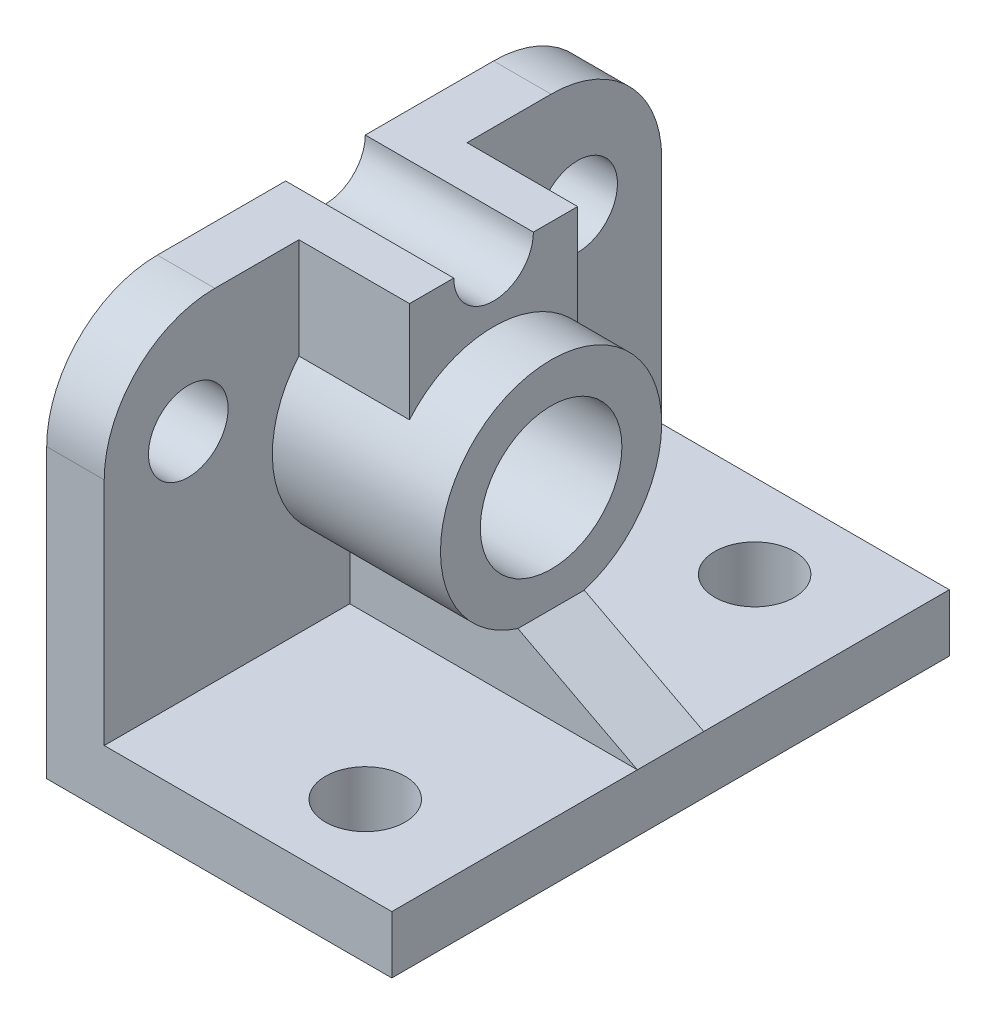
ISO-10303-21;
HEADER;
FILE_DESCRIPTION(('STEP AP214'),'2;1');
FILE_NAME('part.step','',(''),(''),'','','');
FILE_SCHEMA(('AUTOMOTIVE_DESIGN { 1 0 10303 214 1 1 1 1 }'));
ENDSEC;
DATA;
#1=APPLICATION_CONTEXT('core data for automotive mechanical design processes');
#2=APPLICATION_PROTOCOL_DEFINITION('international standard','automotive_design',2000,#1);
#3=PRODUCT_CONTEXT('',#1,'mechanical');
#4=PRODUCT('Part','Part','',(#3));
#5=PRODUCT_RELATED_PRODUCT_CATEGORY('part','',(#4));
#6=PRODUCT_DEFINITION_FORMATION('','',#4);
#7=PRODUCT_DEFINITION_CONTEXT('part definition',#1,'design');
#8=PRODUCT_DEFINITION('design','',#6,#7);
#9=PRODUCT_DEFINITION_SHAPE('','',#8);
#10=(LENGTH_UNIT() NAMED_UNIT(*) SI_UNIT(.MILLI.,.METRE.));
#11=(NAMED_UNIT(*) PLANE_ANGLE_UNIT() SI_UNIT($,.RADIAN.));
#12=(NAMED_UNIT(*) SI_UNIT($,.STERADIAN.) SOLID_ANGLE_UNIT());
#13=UNCERTAINTY_MEASURE_WITH_UNIT(LENGTH_MEASURE(1.E-05),#10,'distance_accuracy_value','');
#14=(GEOMETRIC_REPRESENTATION_CONTEXT(3) GLOBAL_UNCERTAINTY_ASSIGNED_CONTEXT((#13)) GLOBAL_UNIT_ASSIGNED_CONTEXT((#10,
#11,#12)) REPRESENTATION_CONTEXT('',''));
#15=CARTESIAN_POINT('',(0.,0.,0.));
#16=DIRECTION('',(0.,0.,1.));
#17=DIRECTION('',(1.,0.,0.));
#18=AXIS2_PLACEMENT_3D('',#15,#16,#17);
#19=CARTESIAN_POINT('',(13.,13.,63.));
#20=DIRECTION('',(-1.,0.,0.));
#21=DIRECTION('',(0.,0.,1.));
#22=AXIS2_PLACEMENT_3D('',#19,#20,#21);
#23=PLANE('',#22);
#24=CARTESIAN_POINT('',(13.,65.,-44.));
#25=DIRECTION('',(-1.,0.,0.));
#26=DIRECTION('',(0.,0.,1.));
#27=AXIS2_PLACEMENT_3D('',#24,#25,#26);
#28=CIRCLE('',#27,9.00000000000001);
#29=CARTESIAN_POINT('',(13.,65.,-35.));
#30=VERTEX_POINT('',#29);
#31=EDGE_CURVE('E220',#30,#30,#28,.T.);
#32=ORIENTED_EDGE('',*,*,#31,.T.);
#33=EDGE_LOOP('',(#32));
#34=FACE_BOUND('',#33,.T.);
#35=DIRECTION('',(0.,1.,0.));
#36=VECTOR('',#35,1.);
#37=CARTESIAN_POINT('',(13.,13.,-63.));
#38=LINE('',#37,#36);
#39=CARTESIAN_POINT('',(13.,13.,-63.));
#40=VERTEX_POINT('',#39);
#41=CARTESIAN_POINT('',(13.,65.,-63.));
#42=VERTEX_POINT('',#41);
#43=EDGE_CURVE('E271',#40,#42,#38,.T.);
#44=ORIENTED_EDGE('',*,*,#43,.T.);
#45=CARTESIAN_POINT('',(13.,65.,-38.));
#46=DIRECTION('',(-1.,0.,0.));
#47=DIRECTION('',(0.,0.,1.));
#48=AXIS2_PLACEMENT_3D('',#45,#46,#47);
#49=CIRCLE('',#48,25.);
#50=CARTESIAN_POINT('',(13.,90.,-38.));
#51=VERTEX_POINT('',#50);
#52=EDGE_CURVE('E237',#42,#51,#49,.F.);
#53=ORIENTED_EDGE('',*,*,#52,.T.);
#54=DIRECTION('',(0.,0.,-1.));
#55=VECTOR('',#54,1.);
#56=CARTESIAN_POINT('',(13.,90.,63.));
#57=LINE('',#56,#55);
#58=CARTESIAN_POINT('',(13.,90.,-19.));
#59=VERTEX_POINT('',#58);
#60=EDGE_CURVE('E278',#59,#51,#57,.T.);
#61=ORIENTED_EDGE('',*,*,#60,.F.);
#62=DIRECTION('',(0.,-1.,0.));
#63=VECTOR('',#62,1.);
#64=CARTESIAN_POINT('',(13.,0.,-19.));
#65=LINE('',#64,#63);
#66=CARTESIAN_POINT('',(13.,67.2480768092719,-19.));
#67=VERTEX_POINT('',#66);
#68=EDGE_CURVE('E436',#59,#67,#65,.T.);
#69=ORIENTED_EDGE('',*,*,#68,.T.);
#70=CARTESIAN_POINT('',(13.,51.,0.));
#71=DIRECTION('',(1.,0.,0.));
#72=DIRECTION('',(0.,0.,-1.));
#73=AXIS2_PLACEMENT_3D('',#70,#71,#72);
#74=CIRCLE('',#73,25.);
#75=CARTESIAN_POINT('',(13.,27.1515199645764,-7.5));
#76=VERTEX_POINT('',#75);
#77=EDGE_CURVE('E468',#76,#67,#74,.T.);
#78=ORIENTED_EDGE('',*,*,#77,.F.);
#79=DIRECTION('',(0.,1.,0.));
#80=VECTOR('',#79,1.);
#81=CARTESIAN_POINT('',(13.,0.,-7.5));
#82=LINE('',#81,#80);
#83=CARTESIAN_POINT('',(13.,13.,-7.5));
#84=VERTEX_POINT('',#83);
#85=EDGE_CURVE('E215',#84,#76,#82,.T.);
#86=ORIENTED_EDGE('',*,*,#85,.F.);
#87=DIRECTION('',(0.,0.,-1.));
#88=VECTOR('',#87,1.);
#89=CARTESIAN_POINT('',(13.,13.,63.));
#90=LINE('',#89,#88);
#91=EDGE_CURVE('E280',#84,#40,#90,.T.);
#92=ORIENTED_EDGE('',*,*,#91,.T.);
#93=EDGE_LOOP('',(#44,#53,#61,#69,#78,#86,#92));
#94=FACE_BOUND('',#93,.T.);
#95=ADVANCED_FACE('F39',(#34,#94),#23,.F.);
#96=CARTESIAN_POINT('',(13.,65.,44.));
#97=DIRECTION('',(1.,0.,0.));
#98=DIRECTION('',(0.,0.,-1.));
#99=AXIS2_PLACEMENT_3D('',#96,#97,#98);
#100=CIRCLE('',#99,9.00000000000001);
#101=CARTESIAN_POINT('',(13.,65.,35.));
#102=VERTEX_POINT('',#101);
#103=EDGE_CURVE('E216',#102,#102,#100,.T.);
#104=ORIENTED_EDGE('',*,*,#103,.F.);
#105=EDGE_LOOP('',(#104));
#106=FACE_BOUND('',#105,.T.);
#107=CARTESIAN_POINT('',(13.,90.,38.));
#108=VERTEX_POINT('',#107);
#109=CARTESIAN_POINT('',(13.,90.,19.));
#110=VERTEX_POINT('',#109);
#111=EDGE_CURVE('E279',#108,#110,#57,.T.);
#112=ORIENTED_EDGE('',*,*,#111,.F.);
#113=CARTESIAN_POINT('',(13.,65.,38.));
#114=DIRECTION('',(-1.,0.,0.));
#115=DIRECTION('',(0.,0.,1.));
#116=AXIS2_PLACEMENT_3D('',#113,#114,#115);
#117=CIRCLE('',#116,25.);
#118=CARTESIAN_POINT('',(13.,65.,63.));
#119=VERTEX_POINT('',#118);
#120=EDGE_CURVE('E11',#108,#119,#117,.F.);
#121=ORIENTED_EDGE('',*,*,#120,.T.);
#122=DIRECTION('',(0.,1.,0.));
#123=VECTOR('',#122,1.);
#124=CARTESIAN_POINT('',(13.,13.,63.));
#125=LINE('',#124,#123);
#126=CARTESIAN_POINT('',(13.,13.,63.));
#127=VERTEX_POINT('',#126);
#128=EDGE_CURVE('E248',#127,#119,#125,.T.);
#129=ORIENTED_EDGE('',*,*,#128,.F.);
#130=CARTESIAN_POINT('',(13.,13.,7.5));
#131=VERTEX_POINT('',#130);
#132=EDGE_CURVE('E202',#127,#131,#90,.T.);
#133=ORIENTED_EDGE('',*,*,#132,.T.);
#134=DIRECTION('',(0.,-1.,0.));
#135=VECTOR('',#134,1.);
#136=CARTESIAN_POINT('',(13.,0.,7.5));
#137=LINE('',#136,#135);
#138=CARTESIAN_POINT('',(13.,27.1515199645764,7.5));
#139=VERTEX_POINT('',#138);
#140=EDGE_CURVE('E188',#139,#131,#137,.T.);
#141=ORIENTED_EDGE('',*,*,#140,.F.);
#142=CARTESIAN_POINT('',(13.,67.2480768092719,19.));
#143=VERTEX_POINT('',#142);
#144=EDGE_CURVE('E463',#143,#139,#74,.T.);
#145=ORIENTED_EDGE('',*,*,#144,.F.);
#146=DIRECTION('',(0.,-1.,0.));
#147=VECTOR('',#146,1.);
#148=CARTESIAN_POINT('',(13.,0.,19.));
#149=LINE('',#148,#147);
#150=EDGE_CURVE('E211',#110,#143,#149,.T.);
#151=ORIENTED_EDGE('',*,*,#150,.F.);
#152=EDGE_LOOP('',(#112,#121,#129,#133,#141,#145,#151));
#153=FACE_BOUND('',#152,.T.);
#154=ADVANCED_FACE('F312',(#106,#153),#23,.F.);
#155=CARTESIAN_POINT('',(13.,13.,63.));
#156=DIRECTION('',(0.,-1.,0.));
#157=DIRECTION('',(1.,0.,0.));
#158=AXIS2_PLACEMENT_3D('',#155,#156,#157);
#159=PLANE('',#158);
#160=CARTESIAN_POINT('',(53.,13.,-44.));
#161=DIRECTION('',(0.,-1.,0.));
#162=DIRECTION('',(-1.,0.,0.));
#163=AXIS2_PLACEMENT_3D('',#160,#161,#162);
#164=CIRCLE('',#163,9.);
#165=CARTESIAN_POINT('',(44.,13.,-44.));
#166=VERTEX_POINT('',#165);
#167=EDGE_CURVE('E228',#166,#166,#164,.T.);
#168=ORIENTED_EDGE('',*,*,#167,.T.);
#169=EDGE_LOOP('',(#168));
#170=FACE_BOUND('',#169,.T.);
#171=DIRECTION('',(-1.,0.,0.));
#172=VECTOR('',#171,1.);
#173=CARTESIAN_POINT('',(78.,13.,-7.5));
#174=LINE('',#173,#172);
#175=CARTESIAN_POINT('',(78.,13.,-7.5));
#176=VERTEX_POINT('',#175);
#177=EDGE_CURVE('E193',#176,#84,#174,.T.);
#178=ORIENTED_EDGE('',*,*,#177,.F.);
#179=DIRECTION('',(0.,0.,-1.));
#180=VECTOR('',#179,1.);
#181=CARTESIAN_POINT('',(78.,13.,63.));
#182=LINE('',#181,#180);
#183=CARTESIAN_POINT('',(78.,13.,-63.));
#184=VERTEX_POINT('',#183);
#185=EDGE_CURVE('E181',#176,#184,#182,.T.);
#186=ORIENTED_EDGE('',*,*,#185,.T.);
#187=DIRECTION('',(-1.,0.,0.));
#188=VECTOR('',#187,1.);
#189=CARTESIAN_POINT('',(13.,13.,-63.));
#190=LINE('',#189,#188);
#191=EDGE_CURVE('E268',#184,#40,#190,.T.);
#192=ORIENTED_EDGE('',*,*,#191,.T.);
#193=ORIENTED_EDGE('',*,*,#91,.F.);
#194=EDGE_LOOP('',(#178,#186,#192,#193));
#195=FACE_BOUND('',#194,.T.);
#196=ADVANCED_FACE('F315',(#170,#195),#159,.F.);
#197=CARTESIAN_POINT('',(53.,13.,44.));
#198=DIRECTION('',(0.,1.,0.));
#199=DIRECTION('',(-1.,0.,0.));
#200=AXIS2_PLACEMENT_3D('',#197,#198,#199);
#201=CIRCLE('',#200,9.);
#202=CARTESIAN_POINT('',(44.,13.,44.));
#203=VERTEX_POINT('',#202);
#204=EDGE_CURVE('E224',#203,#203,#201,.T.);
#205=ORIENTED_EDGE('',*,*,#204,.F.);
#206=EDGE_LOOP('',(#205));
#207=FACE_BOUND('',#206,.T.);
#208=DIRECTION('',(-1.,0.,0.));
#209=VECTOR('',#208,1.);
#210=CARTESIAN_POINT('',(78.,13.,7.5));
#211=LINE('',#210,#209);
#212=CARTESIAN_POINT('',(78.,13.,7.5));
#213=VERTEX_POINT('',#212);
#214=EDGE_CURVE('E185',#213,#131,#211,.T.);
#215=ORIENTED_EDGE('',*,*,#214,.T.);
#216=ORIENTED_EDGE('',*,*,#132,.F.);
#217=DIRECTION('',(-1.,0.,0.));
#218=VECTOR('',#217,1.);
#219=CARTESIAN_POINT('',(13.,13.,63.));
#220=LINE('',#219,#218);
#221=CARTESIAN_POINT('',(78.,13.,63.));
#222=VERTEX_POINT('',#221);
#223=EDGE_CURVE('E196',#222,#127,#220,.T.);
#224=ORIENTED_EDGE('',*,*,#223,.F.);
#225=EDGE_CURVE('E178',#222,#213,#182,.T.);
#226=ORIENTED_EDGE('',*,*,#225,.T.);
#227=EDGE_LOOP('',(#215,#216,#224,#226));
#228=FACE_BOUND('',#227,.T.);
#229=ADVANCED_FACE('F195',(#207,#228),#159,.F.);
#230=CARTESIAN_POINT('',(0.,90.,63.));
#231=DIRECTION('',(0.,-1.,0.));
#232=DIRECTION('',(0.,0.,-1.));
#233=AXIS2_PLACEMENT_3D('',#230,#231,#232);
#234=PLANE('',#233);
#235=ORIENTED_EDGE('',*,*,#60,.T.);
#236=DIRECTION('',(-1.,0.,0.));
#237=VECTOR('',#236,1.);
#238=CARTESIAN_POINT('',(0.,90.,-38.));
#239=LINE('',#238,#237);
#240=CARTESIAN_POINT('',(0.,90.,-38.));
#241=VERTEX_POINT('',#240);
#242=EDGE_CURVE('E208',#51,#241,#239,.T.);
#243=ORIENTED_EDGE('',*,*,#242,.T.);
#244=DIRECTION('',(0.,0.,-1.));
#245=VECTOR('',#244,1.);
#246=CARTESIAN_POINT('',(0.,90.,63.));
#247=LINE('',#246,#245);
#248=CARTESIAN_POINT('',(0.,90.,-9.));
#249=VERTEX_POINT('',#248);
#250=EDGE_CURVE('E257',#249,#241,#247,.T.);
#251=ORIENTED_EDGE('',*,*,#250,.F.);
#252=DIRECTION('',(-1.,0.,0.));
#253=VECTOR('',#252,1.);
#254=CARTESIAN_POINT('',(38.,90.,-9.));
#255=LINE('',#254,#253);
#256=CARTESIAN_POINT('',(38.,90.,-9.));
#257=VERTEX_POINT('',#256);
#258=EDGE_CURVE('E450',#257,#249,#255,.T.);
#259=ORIENTED_EDGE('',*,*,#258,.F.);
#260=DIRECTION('',(0.,0.,1.));
#261=VECTOR('',#260,1.);
#262=CARTESIAN_POINT('',(38.,90.,0.));
#263=LINE('',#262,#261);
#264=CARTESIAN_POINT('',(38.,90.,-19.));
#265=VERTEX_POINT('',#264);
#266=EDGE_CURVE('E439',#265,#257,#263,.T.);
#267=ORIENTED_EDGE('',*,*,#266,.F.);
#268=DIRECTION('',(-1.,0.,0.));
#269=VECTOR('',#268,1.);
#270=CARTESIAN_POINT('',(38.,90.,-19.));
#271=LINE('',#270,#269);
#272=EDGE_CURVE('E290',#265,#59,#271,.T.);
#273=ORIENTED_EDGE('',*,*,#272,.T.);
#274=EDGE_LOOP('',(#235,#243,#251,#259,#267,#273));
#275=FACE_BOUND('',#274,.T.);
#276=ADVANCED_FACE('F287',(#275),#234,.F.);
#277=CARTESIAN_POINT('',(51.,51.,0.));
#278=DIRECTION('',(-1.,0.,0.));
#279=DIRECTION('',(0.,0.,1.));
#280=AXIS2_PLACEMENT_3D('',#277,#278,#279);
#281=CYLINDRICAL_SURFACE('',#280,25.);
#282=DIRECTION('',(-1.,0.,0.));
#283=VECTOR('',#282,1.);
#284=CARTESIAN_POINT('',(38.,67.2480768092719,19.));
#285=LINE('',#284,#283);
#286=CARTESIAN_POINT('',(38.,67.248076809272,19.));
#287=VERTEX_POINT('',#286);
#288=EDGE_CURVE('E455',#287,#143,#285,.T.);
#289=ORIENTED_EDGE('',*,*,#288,.T.);
#290=ORIENTED_EDGE('',*,*,#144,.T.);
#291=DIRECTION('',(-1.,0.,0.));
#292=VECTOR('',#291,1.);
#293=CARTESIAN_POINT('',(51.,27.1515199645764,7.5));
#294=LINE('',#293,#292);
#295=CARTESIAN_POINT('',(51.,27.1515199645764,7.5));
#296=VERTEX_POINT('',#295);
#297=EDGE_CURVE('E266',#296,#139,#294,.T.);
#298=ORIENTED_EDGE('',*,*,#297,.F.);
#299=CARTESIAN_POINT('',(51.,51.,0.));
#300=DIRECTION('',(1.,0.,0.));
#301=DIRECTION('',(0.,0.,-1.));
#302=AXIS2_PLACEMENT_3D('',#299,#300,#301);
#303=CIRCLE('',#302,25.);
#304=CARTESIAN_POINT('',(51.,27.1515199645764,-7.5));
#305=VERTEX_POINT('',#304);
#306=EDGE_CURVE('E467',#305,#296,#303,.T.);
#307=ORIENTED_EDGE('',*,*,#306,.F.);
#308=DIRECTION('',(-1.,0.,0.));
#309=VECTOR('',#308,1.);
#310=CARTESIAN_POINT('',(51.,27.1515199645764,-7.5));
#311=LINE('',#310,#309);
#312=EDGE_CURVE('E471',#305,#76,#311,.T.);
#313=ORIENTED_EDGE('',*,*,#312,.T.);
#314=ORIENTED_EDGE('',*,*,#77,.T.);
#315=DIRECTION('',(-1.,0.,0.));
#316=VECTOR('',#315,1.);
#317=CARTESIAN_POINT('',(38.,67.2480768092719,-19.));
#318=LINE('',#317,#316);
#319=CARTESIAN_POINT('',(38.,67.2480768092719,-19.));
#320=VERTEX_POINT('',#319);
#321=EDGE_CURVE('E453',#320,#67,#318,.T.);
#322=ORIENTED_EDGE('',*,*,#321,.F.);
#323=CARTESIAN_POINT('',(38.,51.,0.));
#324=DIRECTION('',(1.,0.,0.));
#325=DIRECTION('',(0.,0.,-1.));
#326=AXIS2_PLACEMENT_3D('',#323,#324,#325);
#327=CIRCLE('',#326,25.);
#328=EDGE_CURVE('E442',#320,#287,#327,.T.);
#329=ORIENTED_EDGE('',*,*,#328,.T.);
#330=EDGE_LOOP('',(#289,#290,#298,#307,#313,#314,#322,#329));
#331=FACE_BOUND('',#330,.T.);
#332=ADVANCED_FACE('F333',(#331),#281,.T.);
#333=CARTESIAN_POINT('',(0.,0.,63.));
#334=DIRECTION('',(0.,1.,0.));
#335=DIRECTION('',(0.,0.,1.));
#336=AXIS2_PLACEMENT_3D('',#333,#334,#335);
#337=PLANE('',#336);
#338=CARTESIAN_POINT('',(53.,0.,-44.));
#339=DIRECTION('',(0.,1.,0.));
#340=DIRECTION('',(0.,0.,1.));
#341=AXIS2_PLACEMENT_3D('',#338,#339,#340);
#342=CIRCLE('',#341,9.);
#343=CARTESIAN_POINT('',(53.,0.,-35.));
#344=VERTEX_POINT('',#343);
#345=EDGE_CURVE('E225',#344,#344,#342,.F.);
#346=ORIENTED_EDGE('',*,*,#345,.F.);
#347=EDGE_LOOP('',(#346));
#348=FACE_BOUND('',#347,.T.);
#349=CARTESIAN_POINT('',(53.,0.,44.));
#350=DIRECTION('',(0.,1.,0.));
#351=DIRECTION('',(0.,0.,1.));
#352=AXIS2_PLACEMENT_3D('',#349,#350,#351);
#353=CIRCLE('',#352,9.);
#354=CARTESIAN_POINT('',(53.,0.,53.));
#355=VERTEX_POINT('',#354);
#356=EDGE_CURVE('E221',#355,#355,#353,.T.);
#357=ORIENTED_EDGE('',*,*,#356,.T.);
#358=EDGE_LOOP('',(#357));
#359=FACE_BOUND('',#358,.T.);
#360=DIRECTION('',(1.,0.,0.));
#361=VECTOR('',#360,1.);
#362=CARTESIAN_POINT('',(0.,0.,-63.));
#363=LINE('',#362,#361);
#364=CARTESIAN_POINT('',(0.,0.,-63.));
#365=VERTEX_POINT('',#364);
#366=CARTESIAN_POINT('',(78.,0.,-63.));
#367=VERTEX_POINT('',#366);
#368=EDGE_CURVE('E262',#365,#367,#363,.T.);
#369=ORIENTED_EDGE('',*,*,#368,.T.);
#370=DIRECTION('',(0.,0.,-1.));
#371=VECTOR('',#370,1.);
#372=CARTESIAN_POINT('',(78.,0.,63.));
#373=LINE('',#372,#371);
#374=CARTESIAN_POINT('',(78.,0.,63.));
#375=VERTEX_POINT('',#374);
#376=EDGE_CURVE('E197',#375,#367,#373,.T.);
#377=ORIENTED_EDGE('',*,*,#376,.F.);
#378=DIRECTION('',(1.,0.,0.));
#379=VECTOR('',#378,1.);
#380=CARTESIAN_POINT('',(0.,0.,63.));
#381=LINE('',#380,#379);
#382=CARTESIAN_POINT('',(0.,0.,63.));
#383=VERTEX_POINT('',#382);
#384=EDGE_CURVE('E275',#383,#375,#381,.T.);
#385=ORIENTED_EDGE('',*,*,#384,.F.);
#386=DIRECTION('',(0.,0.,-1.));
#387=VECTOR('',#386,1.);
#388=CARTESIAN_POINT('',(0.,0.,63.));
#389=LINE('',#388,#387);
#390=EDGE_CURVE('E254',#383,#365,#389,.T.);
#391=ORIENTED_EDGE('',*,*,#390,.T.);
#392=EDGE_LOOP('',(#369,#377,#385,#391));
#393=FACE_BOUND('',#392,.T.);
#394=ADVANCED_FACE('F306',(#348,#359,#393),#337,.F.);
#395=CARTESIAN_POINT('',(78.,0.,63.));
#396=DIRECTION('',(-1.,0.,0.));
#397=DIRECTION('',(0.,0.,1.));
#398=AXIS2_PLACEMENT_3D('',#395,#396,#397);
#399=PLANE('',#398);
#400=ORIENTED_EDGE('',*,*,#185,.F.);
#401=DIRECTION('',(0.,0.,1.));
#402=VECTOR('',#401,1.);
#403=CARTESIAN_POINT('',(78.,13.,-30.5));
#404=LINE('',#403,#402);
#405=EDGE_CURVE('E165',#176,#213,#404,.T.);
#406=ORIENTED_EDGE('',*,*,#405,.T.);
#407=ORIENTED_EDGE('',*,*,#225,.F.);
#408=DIRECTION('',(0.,1.,0.));
#409=VECTOR('',#408,1.);
#410=CARTESIAN_POINT('',(78.,0.,63.));
#411=LINE('',#410,#409);
#412=EDGE_CURVE('E307',#375,#222,#411,.T.);
#413=ORIENTED_EDGE('',*,*,#412,.F.);
#414=ORIENTED_EDGE('',*,*,#376,.T.);
#415=DIRECTION('',(0.,1.,0.));
#416=VECTOR('',#415,1.);
#417=CARTESIAN_POINT('',(78.,0.,-63.));
#418=LINE('',#417,#416);
#419=EDGE_CURVE('E265',#367,#184,#418,.T.);
#420=ORIENTED_EDGE('',*,*,#419,.T.);
#421=EDGE_LOOP('',(#400,#406,#407,#413,#414,#420));
#422=FACE_BOUND('',#421,.T.);
#423=ADVANCED_FACE('F176',(#422),#399,.F.);
#424=CARTESIAN_POINT('',(0.,90.,38.));
#425=VERTEX_POINT('',#424);
#426=CARTESIAN_POINT('',(0.,90.,9.));
#427=VERTEX_POINT('',#426);
#428=EDGE_CURVE('E277',#425,#427,#247,.T.);
#429=ORIENTED_EDGE('',*,*,#428,.F.);
#430=DIRECTION('',(-1.,0.,0.));
#431=VECTOR('',#430,1.);
#432=CARTESIAN_POINT('',(13.,90.,38.));
#433=LINE('',#432,#431);
#434=EDGE_CURVE('E47',#425,#108,#433,.F.);
#435=ORIENTED_EDGE('',*,*,#434,.T.);
#436=ORIENTED_EDGE('',*,*,#111,.T.);
#437=DIRECTION('',(-1.,0.,0.));
#438=VECTOR('',#437,1.);
#439=CARTESIAN_POINT('',(38.,90.,19.));
#440=LINE('',#439,#438);
#441=CARTESIAN_POINT('',(38.,90.,19.));
#442=VERTEX_POINT('',#441);
#443=EDGE_CURVE('E458',#442,#110,#440,.T.);
#444=ORIENTED_EDGE('',*,*,#443,.F.);
#445=CARTESIAN_POINT('',(38.,90.,9.));
#446=VERTEX_POINT('',#445);
#447=EDGE_CURVE('E435',#446,#442,#263,.T.);
#448=ORIENTED_EDGE('',*,*,#447,.F.);
#449=DIRECTION('',(-1.,0.,0.));
#450=VECTOR('',#449,1.);
#451=CARTESIAN_POINT('',(38.,90.,9.));
#452=LINE('',#451,#450);
#453=EDGE_CURVE('E460',#446,#427,#452,.T.);
#454=ORIENTED_EDGE('',*,*,#453,.T.);
#455=EDGE_LOOP('',(#429,#435,#436,#444,#448,#454));
#456=FACE_BOUND('',#455,.T.);
#457=ADVANCED_FACE('F327',(#456),#234,.F.);
#458=CARTESIAN_POINT('',(0.,0.,63.));
#459=DIRECTION('',(1.,0.,0.));
#460=DIRECTION('',(0.,0.,-1.));
#461=AXIS2_PLACEMENT_3D('',#458,#459,#460);
#462=PLANE('',#461);
#463=CARTESIAN_POINT('',(0.,65.,-44.));
#464=DIRECTION('',(1.,0.,0.));
#465=DIRECTION('',(0.,0.,-1.));
#466=AXIS2_PLACEMENT_3D('',#463,#464,#465);
#467=CIRCLE('',#466,9.00000000000001);
#468=CARTESIAN_POINT('',(0.,65.,-53.));
#469=VERTEX_POINT('',#468);
#470=EDGE_CURVE('E217',#469,#469,#467,.F.);
#471=ORIENTED_EDGE('',*,*,#470,.F.);
#472=EDGE_LOOP('',(#471));
#473=FACE_BOUND('',#472,.T.);
#474=CARTESIAN_POINT('',(0.,65.,44.));
#475=DIRECTION('',(1.,0.,0.));
#476=DIRECTION('',(0.,0.,-1.));
#477=AXIS2_PLACEMENT_3D('',#474,#475,#476);
#478=CIRCLE('',#477,9.00000000000001);
#479=CARTESIAN_POINT('',(0.,65.,35.));
#480=VERTEX_POINT('',#479);
#481=EDGE_CURVE('E212',#480,#480,#478,.T.);
#482=ORIENTED_EDGE('',*,*,#481,.T.);
#483=EDGE_LOOP('',(#482));
#484=FACE_BOUND('',#483,.T.);
#485=CARTESIAN_POINT('',(0.,51.,0.));
#486=DIRECTION('',(1.,0.,0.));
#487=DIRECTION('',(0.,0.,-1.));
#488=AXIS2_PLACEMENT_3D('',#485,#486,#487);
#489=CIRCLE('',#488,16.);
#490=CARTESIAN_POINT('',(0.,51.,-16.));
#491=VERTEX_POINT('',#490);
#492=EDGE_CURVE('E192',#491,#491,#489,.T.);
#493=ORIENTED_EDGE('',*,*,#492,.T.);
#494=EDGE_LOOP('',(#493));
#495=FACE_BOUND('',#494,.T.);
#496=ORIENTED_EDGE('',*,*,#250,.T.);
#497=CARTESIAN_POINT('',(0.,65.,-38.));
#498=DIRECTION('',(1.,0.,0.));
#499=DIRECTION('',(0.,0.,-1.));
#500=AXIS2_PLACEMENT_3D('',#497,#498,#499);
#501=CIRCLE('',#500,25.);
#502=CARTESIAN_POINT('',(0.,65.,-63.));
#503=VERTEX_POINT('',#502);
#504=EDGE_CURVE('E233',#241,#503,#501,.F.);
#505=ORIENTED_EDGE('',*,*,#504,.T.);
#506=DIRECTION('',(0.,-1.,0.));
#507=VECTOR('',#506,1.);
#508=CARTESIAN_POINT('',(0.,0.,-63.));
#509=LINE('',#508,#507);
#510=EDGE_CURVE('E274',#503,#365,#509,.T.);
#511=ORIENTED_EDGE('',*,*,#510,.T.);
#512=ORIENTED_EDGE('',*,*,#390,.F.);
#513=DIRECTION('',(0.,-1.,0.));
#514=VECTOR('',#513,1.);
#515=CARTESIAN_POINT('',(0.,0.,63.));
#516=LINE('',#515,#514);
#517=CARTESIAN_POINT('',(0.,65.,63.));
#518=VERTEX_POINT('',#517);
#519=EDGE_CURVE('E246',#518,#383,#516,.T.);
#520=ORIENTED_EDGE('',*,*,#519,.F.);
#521=CARTESIAN_POINT('',(0.,65.,38.));
#522=DIRECTION('',(1.,0.,0.));
#523=DIRECTION('',(0.,0.,-1.));
#524=AXIS2_PLACEMENT_3D('',#521,#522,#523);
#525=CIRCLE('',#524,25.);
#526=EDGE_CURVE('E231',#518,#425,#525,.F.);
#527=ORIENTED_EDGE('',*,*,#526,.T.);
#528=ORIENTED_EDGE('',*,*,#428,.T.);
#529=CARTESIAN_POINT('',(0.,90.,0.));
#530=DIRECTION('',(1.,0.,0.));
#531=DIRECTION('',(0.,0.,-1.));
#532=AXIS2_PLACEMENT_3D('',#529,#530,#531);
#533=CIRCLE('',#532,9.);
#534=EDGE_CURVE('E200',#427,#249,#533,.T.);
#535=ORIENTED_EDGE('',*,*,#534,.T.);
#536=EDGE_LOOP('',(#496,#505,#511,#512,#520,#527,#528,#535));
#537=FACE_BOUND('',#536,.T.);
#538=ADVANCED_FACE('F252',(#473,#484,#495,#537),#462,.F.);
#539=CARTESIAN_POINT('',(0.,0.,63.));
#540=DIRECTION('',(0.,0.,1.));
#541=DIRECTION('',(1.,0.,0.));
#542=AXIS2_PLACEMENT_3D('',#539,#540,#541);
#543=PLANE('',#542);
#544=ORIENTED_EDGE('',*,*,#128,.T.);
#545=DIRECTION('',(-1.,0.,0.));
#546=VECTOR('',#545,1.);
#547=CARTESIAN_POINT('',(0.,65.,63.));
#548=LINE('',#547,#546);
#549=EDGE_CURVE('E239',#119,#518,#548,.T.);
#550=ORIENTED_EDGE('',*,*,#549,.T.);
#551=ORIENTED_EDGE('',*,*,#519,.T.);
#552=ORIENTED_EDGE('',*,*,#384,.T.);
#553=ORIENTED_EDGE('',*,*,#412,.T.);
#554=ORIENTED_EDGE('',*,*,#223,.T.);
#555=EDGE_LOOP('',(#544,#550,#551,#552,#553,#554));
#556=FACE_BOUND('',#555,.T.);
#557=ADVANCED_FACE('F244',(#556),#543,.T.);
#558=CARTESIAN_POINT('',(0.,0.,-63.));
#559=DIRECTION('',(0.,0.,1.));
#560=DIRECTION('',(1.,0.,0.));
#561=AXIS2_PLACEMENT_3D('',#558,#559,#560);
#562=PLANE('',#561);
#563=ORIENTED_EDGE('',*,*,#510,.F.);
#564=DIRECTION('',(-1.,0.,0.));
#565=VECTOR('',#564,1.);
#566=CARTESIAN_POINT('',(0.,65.,-63.));
#567=LINE('',#566,#565);
#568=EDGE_CURVE('E235',#503,#42,#567,.F.);
#569=ORIENTED_EDGE('',*,*,#568,.T.);
#570=ORIENTED_EDGE('',*,*,#43,.F.);
#571=ORIENTED_EDGE('',*,*,#191,.F.);
#572=ORIENTED_EDGE('',*,*,#419,.F.);
#573=ORIENTED_EDGE('',*,*,#368,.F.);
#574=EDGE_LOOP('',(#563,#569,#570,#571,#572,#573));
#575=FACE_BOUND('',#574,.T.);
#576=ADVANCED_FACE('F301',(#575),#562,.F.);
#577=CARTESIAN_POINT('',(51.,51.,0.));
#578=DIRECTION('',(-1.,0.,0.));
#579=DIRECTION('',(0.,0.,1.));
#580=AXIS2_PLACEMENT_3D('',#577,#578,#579);
#581=CYLINDRICAL_SURFACE('',#580,16.);
#582=CARTESIAN_POINT('',(51.,51.,0.));
#583=DIRECTION('',(1.,0.,0.));
#584=DIRECTION('',(0.,0.,-1.));
#585=AXIS2_PLACEMENT_3D('',#582,#583,#584);
#586=CIRCLE('',#585,16.);
#587=CARTESIAN_POINT('',(51.,51.,-16.));
#588=VERTEX_POINT('',#587);
#589=EDGE_CURVE('E464',#588,#588,#586,.T.);
#590=ORIENTED_EDGE('',*,*,#589,.T.);
#591=EDGE_LOOP('',(#590));
#592=FACE_BOUND('',#591,.T.);
#593=ORIENTED_EDGE('',*,*,#492,.F.);
#594=EDGE_LOOP('',(#593));
#595=FACE_BOUND('',#594,.T.);
#596=ADVANCED_FACE('F386',(#592,#595),#581,.F.);
#597=CARTESIAN_POINT('',(51.,0.,0.));
#598=DIRECTION('',(1.,0.,0.));
#599=DIRECTION('',(0.,0.,-1.));
#600=AXIS2_PLACEMENT_3D('',#597,#598,#599);
#601=PLANE('',#600);
#602=ORIENTED_EDGE('',*,*,#589,.F.);
#603=EDGE_LOOP('',(#602));
#604=FACE_BOUND('',#603,.T.);
#605=ORIENTED_EDGE('',*,*,#306,.T.);
#606=DIRECTION('',(0.,0.,-1.));
#607=VECTOR('',#606,1.);
#608=CARTESIAN_POINT('',(51.,27.1515199645764,0.));
#609=LINE('',#608,#607);
#610=EDGE_CURVE('E168',#296,#305,#609,.T.);
#611=ORIENTED_EDGE('',*,*,#610,.T.);
#612=EDGE_LOOP('',(#605,#611));
#613=FACE_BOUND('',#612,.T.);
#614=ADVANCED_FACE('F382',(#604,#613),#601,.T.);
#615=CARTESIAN_POINT('',(38.,90.,0.));
#616=DIRECTION('',(-1.,0.,0.));
#617=DIRECTION('',(0.,0.,1.));
#618=AXIS2_PLACEMENT_3D('',#615,#616,#617);
#619=CYLINDRICAL_SURFACE('',#618,9.);
#620=ORIENTED_EDGE('',*,*,#258,.T.);
#621=ORIENTED_EDGE('',*,*,#534,.F.);
#622=ORIENTED_EDGE('',*,*,#453,.F.);
#623=CARTESIAN_POINT('',(38.,90.,0.));
#624=DIRECTION('',(1.,0.,0.));
#625=DIRECTION('',(0.,0.,-1.));
#626=AXIS2_PLACEMENT_3D('',#623,#624,#625);
#627=CIRCLE('',#626,9.);
#628=EDGE_CURVE('E432',#446,#257,#627,.T.);
#629=ORIENTED_EDGE('',*,*,#628,.T.);
#630=EDGE_LOOP('',(#620,#621,#622,#629));
#631=FACE_BOUND('',#630,.T.);
#632=ADVANCED_FACE('F378',(#631),#619,.F.);
#633=CARTESIAN_POINT('',(38.,0.,19.));
#634=DIRECTION('',(0.,0.,-1.));
#635=DIRECTION('',(0.,1.,0.));
#636=AXIS2_PLACEMENT_3D('',#633,#634,#635);
#637=PLANE('',#636);
#638=ORIENTED_EDGE('',*,*,#150,.T.);
#639=ORIENTED_EDGE('',*,*,#288,.F.);
#640=DIRECTION('',(0.,-1.,0.));
#641=VECTOR('',#640,1.);
#642=CARTESIAN_POINT('',(38.,0.,19.));
#643=LINE('',#642,#641);
#644=EDGE_CURVE('E438',#442,#287,#643,.T.);
#645=ORIENTED_EDGE('',*,*,#644,.F.);
#646=ORIENTED_EDGE('',*,*,#443,.T.);
#647=EDGE_LOOP('',(#638,#639,#645,#646));
#648=FACE_BOUND('',#647,.T.);
#649=ADVANCED_FACE('F374',(#648),#637,.F.);
#650=CARTESIAN_POINT('',(38.,0.,-19.));
#651=DIRECTION('',(0.,0.,-1.));
#652=DIRECTION('',(-1.,0.,0.));
#653=AXIS2_PLACEMENT_3D('',#650,#651,#652);
#654=PLANE('',#653);
#655=ORIENTED_EDGE('',*,*,#68,.F.);
#656=ORIENTED_EDGE('',*,*,#272,.F.);
#657=DIRECTION('',(0.,-1.,0.));
#658=VECTOR('',#657,1.);
#659=CARTESIAN_POINT('',(38.,0.,-19.));
#660=LINE('',#659,#658);
#661=EDGE_CURVE('E445',#265,#320,#660,.T.);
#662=ORIENTED_EDGE('',*,*,#661,.T.);
#663=ORIENTED_EDGE('',*,*,#321,.T.);
#664=EDGE_LOOP('',(#655,#656,#662,#663));
#665=FACE_BOUND('',#664,.T.);
#666=ADVANCED_FACE('F370',(#665),#654,.T.);
#667=CARTESIAN_POINT('',(38.,0.,0.));
#668=DIRECTION('',(1.,0.,0.));
#669=DIRECTION('',(0.,0.,-1.));
#670=AXIS2_PLACEMENT_3D('',#667,#668,#669);
#671=PLANE('',#670);
#672=ORIENTED_EDGE('',*,*,#628,.F.);
#673=ORIENTED_EDGE('',*,*,#447,.T.);
#674=ORIENTED_EDGE('',*,*,#644,.T.);
#675=ORIENTED_EDGE('',*,*,#328,.F.);
#676=ORIENTED_EDGE('',*,*,#661,.F.);
#677=ORIENTED_EDGE('',*,*,#266,.T.);
#678=EDGE_LOOP('',(#672,#673,#674,#675,#676,#677));
#679=FACE_BOUND('',#678,.T.);
#680=ADVANCED_FACE('F366',(#679),#671,.T.);
#681=CARTESIAN_POINT('',(78.,0.,-7.5));
#682=DIRECTION('',(0.,0.,1.));
#683=DIRECTION('',(0.,-1.,0.));
#684=AXIS2_PLACEMENT_3D('',#681,#682,#683);
#685=PLANE('',#684);
#686=ORIENTED_EDGE('',*,*,#312,.F.);
#687=DIRECTION('',(0.885714701218595,-0.464229973230138,0.));
#688=VECTOR('',#687,1.);
#689=CARTESIAN_POINT('',(83.3452790564712,10.1983769154117,-7.5));
#690=LINE('',#689,#688);
#691=EDGE_CURVE('E182',#305,#176,#690,.T.);
#692=ORIENTED_EDGE('',*,*,#691,.T.);
#693=ORIENTED_EDGE('',*,*,#177,.T.);
#694=ORIENTED_EDGE('',*,*,#85,.T.);
#695=EDGE_LOOP('',(#686,#692,#693,#694));
#696=FACE_BOUND('',#695,.T.);
#697=ADVANCED_FACE('F363',(#696),#685,.F.);
#698=CARTESIAN_POINT('',(78.,0.,7.5));
#699=DIRECTION('',(0.,0.,-1.));
#700=DIRECTION('',(0.,1.,0.));
#701=AXIS2_PLACEMENT_3D('',#698,#699,#700);
#702=PLANE('',#701);
#703=ORIENTED_EDGE('',*,*,#214,.F.);
#704=DIRECTION('',(0.885714701218595,-0.464229973230138,0.));
#705=VECTOR('',#704,1.);
#706=CARTESIAN_POINT('',(51.,27.1515199645764,7.5));
#707=LINE('',#706,#705);
#708=EDGE_CURVE('E162',#296,#213,#707,.T.);
#709=ORIENTED_EDGE('',*,*,#708,.F.);
#710=ORIENTED_EDGE('',*,*,#297,.T.);
#711=ORIENTED_EDGE('',*,*,#140,.T.);
#712=EDGE_LOOP('',(#703,#709,#710,#711));
#713=FACE_BOUND('',#712,.T.);
#714=ADVANCED_FACE('F186',(#713),#702,.F.);
#715=CARTESIAN_POINT('',(-25.,65.,44.));
#716=DIRECTION('',(1.,0.,0.));
#717=DIRECTION('',(0.,0.,-1.));
#718=AXIS2_PLACEMENT_3D('',#715,#716,#717);
#719=CYLINDRICAL_SURFACE('',#718,9.00000000000001);
#720=ORIENTED_EDGE('',*,*,#103,.T.);
#721=EDGE_LOOP('',(#720));
#722=FACE_BOUND('',#721,.T.);
#723=ORIENTED_EDGE('',*,*,#481,.F.);
#724=EDGE_LOOP('',(#723));
#725=FACE_BOUND('',#724,.T.);
#726=ADVANCED_FACE('F356',(#722,#725),#719,.F.);
#727=CARTESIAN_POINT('',(-25.,65.,-44.));
#728=DIRECTION('',(1.,0.,0.));
#729=DIRECTION('',(0.,0.,-1.));
#730=AXIS2_PLACEMENT_3D('',#727,#728,#729);
#731=CYLINDRICAL_SURFACE('',#730,9.00000000000001);
#732=ORIENTED_EDGE('',*,*,#31,.F.);
#733=EDGE_LOOP('',(#732));
#734=FACE_BOUND('',#733,.T.);
#735=ORIENTED_EDGE('',*,*,#470,.T.);
#736=EDGE_LOOP('',(#735));
#737=FACE_BOUND('',#736,.T.);
#738=ADVANCED_FACE('F347',(#734,#737),#731,.F.);
#739=CARTESIAN_POINT('',(53.,-25.,44.));
#740=DIRECTION('',(0.,1.,0.));
#741=DIRECTION('',(-1.,0.,0.));
#742=AXIS2_PLACEMENT_3D('',#739,#740,#741);
#743=CYLINDRICAL_SURFACE('',#742,9.);
#744=ORIENTED_EDGE('',*,*,#204,.T.);
#745=EDGE_LOOP('',(#744));
#746=FACE_BOUND('',#745,.T.);
#747=ORIENTED_EDGE('',*,*,#356,.F.);
#748=EDGE_LOOP('',(#747));
#749=FACE_BOUND('',#748,.T.);
#750=ADVANCED_FACE('F341',(#746,#749),#743,.F.);
#751=CARTESIAN_POINT('',(53.,-25.,-44.));
#752=DIRECTION('',(0.,1.,0.));
#753=DIRECTION('',(-1.,0.,0.));
#754=AXIS2_PLACEMENT_3D('',#751,#752,#753);
#755=CYLINDRICAL_SURFACE('',#754,9.);
#756=ORIENTED_EDGE('',*,*,#167,.F.);
#757=EDGE_LOOP('',(#756));
#758=FACE_BOUND('',#757,.T.);
#759=ORIENTED_EDGE('',*,*,#345,.T.);
#760=EDGE_LOOP('',(#759));
#761=FACE_BOUND('',#760,.T.);
#762=ADVANCED_FACE('F336',(#758,#761),#755,.F.);
#763=CARTESIAN_POINT('',(0.,65.,-38.));
#764=DIRECTION('',(-1.,0.,0.));
#765=DIRECTION('',(0.,0.,1.));
#766=AXIS2_PLACEMENT_3D('',#763,#764,#765);
#767=CYLINDRICAL_SURFACE('',#766,25.);
#768=ORIENTED_EDGE('',*,*,#52,.F.);
#769=ORIENTED_EDGE('',*,*,#568,.F.);
#770=ORIENTED_EDGE('',*,*,#504,.F.);
#771=ORIENTED_EDGE('',*,*,#242,.F.);
#772=EDGE_LOOP('',(#768,#769,#770,#771));
#773=FACE_BOUND('',#772,.T.);
#774=ADVANCED_FACE('F296',(#773),#767,.T.);
#775=CARTESIAN_POINT('',(0.,65.,38.));
#776=DIRECTION('',(1.,0.,0.));
#777=DIRECTION('',(0.,0.,-1.));
#778=AXIS2_PLACEMENT_3D('',#775,#776,#777);
#779=CYLINDRICAL_SURFACE('',#778,25.);
#780=ORIENTED_EDGE('',*,*,#120,.F.);
#781=ORIENTED_EDGE('',*,*,#434,.F.);
#782=ORIENTED_EDGE('',*,*,#526,.F.);
#783=ORIENTED_EDGE('',*,*,#549,.F.);
#784=EDGE_LOOP('',(#780,#781,#782,#783));
#785=FACE_BOUND('',#784,.T.);
#786=ADVANCED_FACE('F41',(#785),#779,.T.);
#787=CARTESIAN_POINT('',(51.,27.1515199645764,-30.5));
#788=DIRECTION('',(-0.464229973230138,-0.885714701218595,0.));
#789=DIRECTION('',(0.885714701218595,-0.464229973230138,0.));
#790=AXIS2_PLACEMENT_3D('',#787,#788,#789);
#791=PLANE('',#790);
#792=ORIENTED_EDGE('',*,*,#610,.F.);
#793=ORIENTED_EDGE('',*,*,#708,.T.);
#794=ORIENTED_EDGE('',*,*,#405,.F.);
#795=ORIENTED_EDGE('',*,*,#691,.F.);
#796=EDGE_LOOP('',(#792,#793,#794,#795));
#797=FACE_BOUND('',#796,.T.);
#798=ADVANCED_FACE('F164',(#797),#791,.F.);
#799=CLOSED_SHELL('',(#95,#154,#196,#229,#276,#332,#394,#423,#457,#538,#557,#576,#596,#614,#632,
#649,#666,#680,#697,#714,#726,#738,#750,#762,#774,#786,#798));
#800=MANIFOLD_SOLID_BREP('B2',#799);
#801=ADVANCED_BREP_SHAPE_REPRESENTATION('',(#18,#800),#14);
#802=SHAPE_DEFINITION_REPRESENTATION(#9,#801);
ENDSEC;
END-ISO-10303-21;
